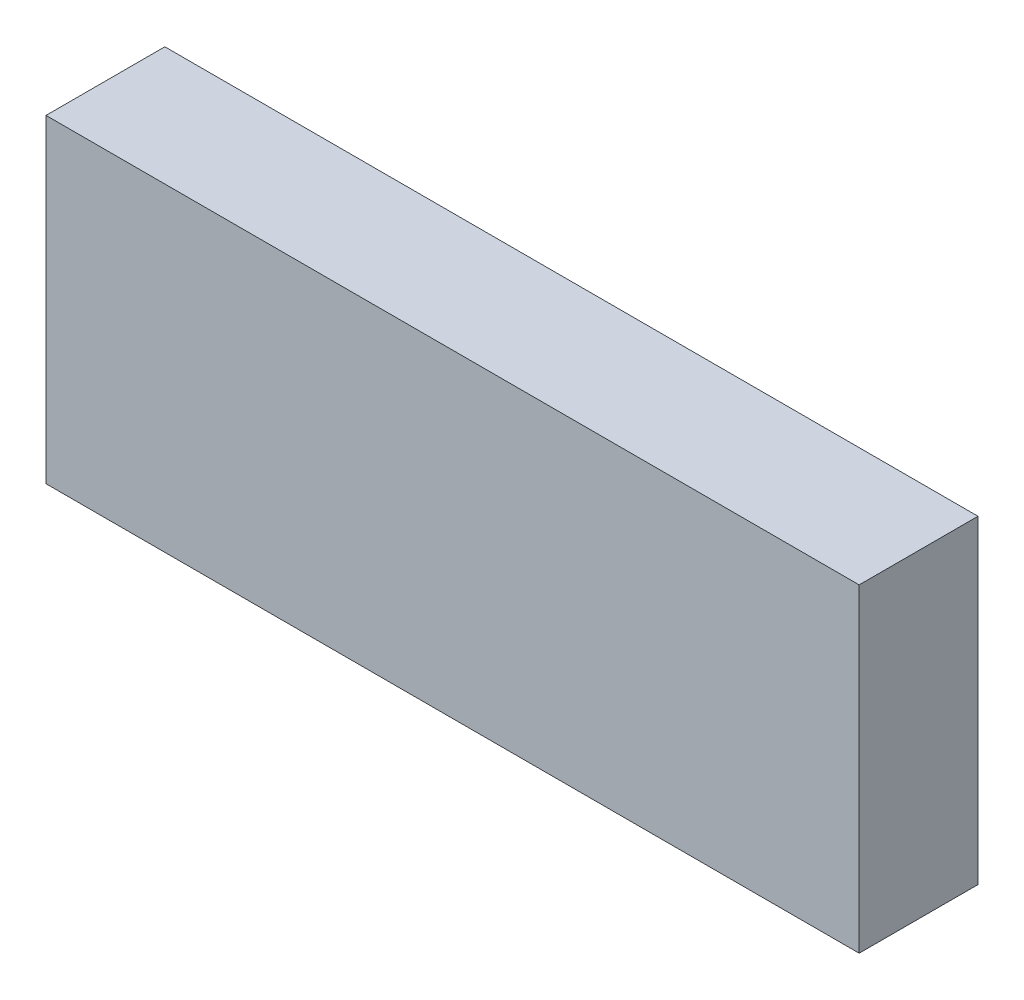
ISO-10303-21;
HEADER;
FILE_DESCRIPTION(('STEP AP214'),'2;1');
FILE_NAME('part.step','',(''),(''),'','','');
FILE_SCHEMA(('AUTOMOTIVE_DESIGN { 1 0 10303 214 1 1 1 1 }'));
ENDSEC;
DATA;
#1=APPLICATION_CONTEXT('core data for automotive mechanical design processes');
#2=APPLICATION_PROTOCOL_DEFINITION('international standard','automotive_design',2000,#1);
#3=PRODUCT_CONTEXT('',#1,'mechanical');
#4=PRODUCT('Part','Part','',(#3));
#5=PRODUCT_RELATED_PRODUCT_CATEGORY('part','',(#4));
#6=PRODUCT_DEFINITION_FORMATION('','',#4);
#7=PRODUCT_DEFINITION_CONTEXT('part definition',#1,'design');
#8=PRODUCT_DEFINITION('design','',#6,#7);
#9=PRODUCT_DEFINITION_SHAPE('','',#8);
#10=(LENGTH_UNIT() NAMED_UNIT(*) SI_UNIT(.MILLI.,.METRE.));
#11=(NAMED_UNIT(*) PLANE_ANGLE_UNIT() SI_UNIT($,.RADIAN.));
#12=(NAMED_UNIT(*) SI_UNIT($,.STERADIAN.) SOLID_ANGLE_UNIT());
#13=UNCERTAINTY_MEASURE_WITH_UNIT(LENGTH_MEASURE(1.E-05),#10,'distance_accuracy_value','');
#14=(GEOMETRIC_REPRESENTATION_CONTEXT(3) GLOBAL_UNCERTAINTY_ASSIGNED_CONTEXT((#13)) GLOBAL_UNIT_ASSIGNED_CONTEXT((#10,
#11,#12)) REPRESENTATION_CONTEXT('',''));
#15=CARTESIAN_POINT('',(0.,0.,0.));
#16=DIRECTION('',(0.,0.,1.));
#17=DIRECTION('',(1.,0.,0.));
#18=AXIS2_PLACEMENT_3D('',#15,#16,#17);
#19=CARTESIAN_POINT('',(-0.0762,-0.6477,0.508));
#20=DIRECTION('',(0.,0.,1.));
#21=DIRECTION('',(1.,0.,0.));
#22=AXIS2_PLACEMENT_3D('',#19,#20,#21);
#23=PLANE('',#22);
#24=DIRECTION('',(0.,1.,0.));
#25=VECTOR('',#24,1.);
#26=CARTESIAN_POINT('',(3.2258,-0.6477,0.508));
#27=LINE('',#26,#25);
#28=CARTESIAN_POINT('',(3.2258,0.6477,0.508));
#29=VERTEX_POINT('',#28);
#30=CARTESIAN_POINT('',(3.2258,-0.6477,0.508));
#31=VERTEX_POINT('',#30);
#32=EDGE_CURVE('E76',#29,#31,#27,.F.);
#33=ORIENTED_EDGE('',*,*,#32,.F.);
#34=DIRECTION('',(1.,0.,0.));
#35=VECTOR('',#34,1.);
#36=CARTESIAN_POINT('',(-0.0762,0.6477,0.508));
#37=LINE('',#36,#35);
#38=CARTESIAN_POINT('',(-0.0762,0.6477,0.508));
#39=VERTEX_POINT('',#38);
#40=EDGE_CURVE('E58',#39,#29,#37,.T.);
#41=ORIENTED_EDGE('',*,*,#40,.F.);
#42=DIRECTION('',(0.,1.,0.));
#43=VECTOR('',#42,1.);
#44=CARTESIAN_POINT('',(-0.0762,-0.6477,0.508));
#45=LINE('',#44,#43);
#46=CARTESIAN_POINT('',(-0.0762,-0.6477,0.508));
#47=VERTEX_POINT('',#46);
#48=EDGE_CURVE('E20',#39,#47,#45,.F.);
#49=ORIENTED_EDGE('',*,*,#48,.T.);
#50=DIRECTION('',(1.,0.,0.));
#51=VECTOR('',#50,1.);
#52=CARTESIAN_POINT('',(-0.0762,-0.6477,0.508));
#53=LINE('',#52,#51);
#54=EDGE_CURVE('E55',#47,#31,#53,.T.);
#55=ORIENTED_EDGE('',*,*,#54,.T.);
#56=EDGE_LOOP('',(#33,#41,#49,#55));
#57=FACE_BOUND('',#56,.T.);
#58=ADVANCED_FACE('F17',(#57),#23,.T.);
#59=CARTESIAN_POINT('',(-0.0762,-0.6477,0.0254));
#60=DIRECTION('',(1.,0.,0.));
#61=DIRECTION('',(0.,0.,-1.));
#62=AXIS2_PLACEMENT_3D('',#59,#60,#61);
#63=PLANE('',#62);
#64=DIRECTION('',(0.,0.,1.));
#65=VECTOR('',#64,1.);
#66=CARTESIAN_POINT('',(-0.0762,0.6477,0.0254));
#67=LINE('',#66,#65);
#68=CARTESIAN_POINT('',(-0.0762,0.6477,0.0254));
#69=VERTEX_POINT('',#68);
#70=EDGE_CURVE('E78',#69,#39,#67,.T.);
#71=ORIENTED_EDGE('',*,*,#70,.F.);
#72=DIRECTION('',(0.,1.,0.));
#73=VECTOR('',#72,1.);
#74=CARTESIAN_POINT('',(-0.0762,-0.6477,0.0254));
#75=LINE('',#74,#73);
#76=CARTESIAN_POINT('',(-0.0762,-0.6477,0.0254));
#77=VERTEX_POINT('',#76);
#78=EDGE_CURVE('E73',#69,#77,#75,.F.);
#79=ORIENTED_EDGE('',*,*,#78,.T.);
#80=DIRECTION('',(0.,0.,1.));
#81=VECTOR('',#80,1.);
#82=CARTESIAN_POINT('',(-0.0762,-0.6477,0.0254));
#83=LINE('',#82,#81);
#84=EDGE_CURVE('E63',#77,#47,#83,.T.);
#85=ORIENTED_EDGE('',*,*,#84,.T.);
#86=ORIENTED_EDGE('',*,*,#48,.F.);
#87=EDGE_LOOP('',(#71,#79,#85,#86));
#88=FACE_BOUND('',#87,.T.);
#89=ADVANCED_FACE('F72',(#88),#63,.F.);
#90=CARTESIAN_POINT('',(-0.0762,-0.6477,0.0254));
#91=DIRECTION('',(0.,1.,0.));
#92=DIRECTION('',(0.,0.,1.));
#93=AXIS2_PLACEMENT_3D('',#90,#91,#92);
#94=PLANE('',#93);
#95=ORIENTED_EDGE('',*,*,#54,.F.);
#96=ORIENTED_EDGE('',*,*,#84,.F.);
#97=DIRECTION('',(1.,0.,0.));
#98=VECTOR('',#97,1.);
#99=CARTESIAN_POINT('',(-0.0762,-0.6477,0.0254));
#100=LINE('',#99,#98);
#101=CARTESIAN_POINT('',(3.2258,-0.6477,0.0254));
#102=VERTEX_POINT('',#101);
#103=EDGE_CURVE('E83',#77,#102,#100,.T.);
#104=ORIENTED_EDGE('',*,*,#103,.T.);
#105=DIRECTION('',(0.,0.,-1.));
#106=VECTOR('',#105,1.);
#107=CARTESIAN_POINT('',(3.2258,-0.6477,0.0254));
#108=LINE('',#107,#106);
#109=EDGE_CURVE('E69',#31,#102,#108,.T.);
#110=ORIENTED_EDGE('',*,*,#109,.F.);
#111=EDGE_LOOP('',(#95,#96,#104,#110));
#112=FACE_BOUND('',#111,.T.);
#113=ADVANCED_FACE('F66',(#112),#94,.F.);
#114=CARTESIAN_POINT('',(3.2258,-0.6477,0.0254));
#115=DIRECTION('',(1.,0.,0.));
#116=DIRECTION('',(0.,0.,-1.));
#117=AXIS2_PLACEMENT_3D('',#114,#115,#116);
#118=PLANE('',#117);
#119=DIRECTION('',(0.,0.,1.));
#120=VECTOR('',#119,1.);
#121=CARTESIAN_POINT('',(3.2258,0.6477,0.0254));
#122=LINE('',#121,#120);
#123=CARTESIAN_POINT('',(3.2258,0.6477,0.0254));
#124=VERTEX_POINT('',#123);
#125=EDGE_CURVE('E34',#29,#124,#122,.F.);
#126=ORIENTED_EDGE('',*,*,#125,.F.);
#127=ORIENTED_EDGE('',*,*,#32,.T.);
#128=ORIENTED_EDGE('',*,*,#109,.T.);
#129=DIRECTION('',(0.,1.,0.));
#130=VECTOR('',#129,1.);
#131=CARTESIAN_POINT('',(3.2258,-0.6477,0.0254));
#132=LINE('',#131,#130);
#133=EDGE_CURVE('E26',#102,#124,#132,.T.);
#134=ORIENTED_EDGE('',*,*,#133,.T.);
#135=EDGE_LOOP('',(#126,#127,#128,#134));
#136=FACE_BOUND('',#135,.T.);
#137=ADVANCED_FACE('F88',(#136),#118,.T.);
#138=CARTESIAN_POINT('',(-0.0762,0.6477,0.0254));
#139=DIRECTION('',(0.,1.,0.));
#140=DIRECTION('',(0.,0.,1.));
#141=AXIS2_PLACEMENT_3D('',#138,#139,#140);
#142=PLANE('',#141);
#143=ORIENTED_EDGE('',*,*,#40,.T.);
#144=ORIENTED_EDGE('',*,*,#125,.T.);
#145=DIRECTION('',(1.,0.,0.));
#146=VECTOR('',#145,1.);
#147=CARTESIAN_POINT('',(-0.0762,0.6477,0.0254));
#148=LINE('',#147,#146);
#149=EDGE_CURVE('E11',#124,#69,#148,.F.);
#150=ORIENTED_EDGE('',*,*,#149,.T.);
#151=ORIENTED_EDGE('',*,*,#70,.T.);
#152=EDGE_LOOP('',(#143,#144,#150,#151));
#153=FACE_BOUND('',#152,.T.);
#154=ADVANCED_FACE('F91',(#153),#142,.T.);
#155=CARTESIAN_POINT('',(-0.0762,-0.6477,0.0254));
#156=DIRECTION('',(0.,0.,1.));
#157=DIRECTION('',(1.,0.,0.));
#158=AXIS2_PLACEMENT_3D('',#155,#156,#157);
#159=PLANE('',#158);
#160=ORIENTED_EDGE('',*,*,#133,.F.);
#161=ORIENTED_EDGE('',*,*,#103,.F.);
#162=ORIENTED_EDGE('',*,*,#78,.F.);
#163=ORIENTED_EDGE('',*,*,#149,.F.);
#164=EDGE_LOOP('',(#160,#161,#162,#163));
#165=FACE_BOUND('',#164,.T.);
#166=ADVANCED_FACE('F90',(#165),#159,.F.);
#167=CLOSED_SHELL('',(#58,#89,#113,#137,#154,#166));
#168=MANIFOLD_SOLID_BREP('B1',#167);
#169=ADVANCED_BREP_SHAPE_REPRESENTATION('',(#18,#168),#14);
#170=SHAPE_DEFINITION_REPRESENTATION(#9,#169);
ENDSEC;
END-ISO-10303-21;
